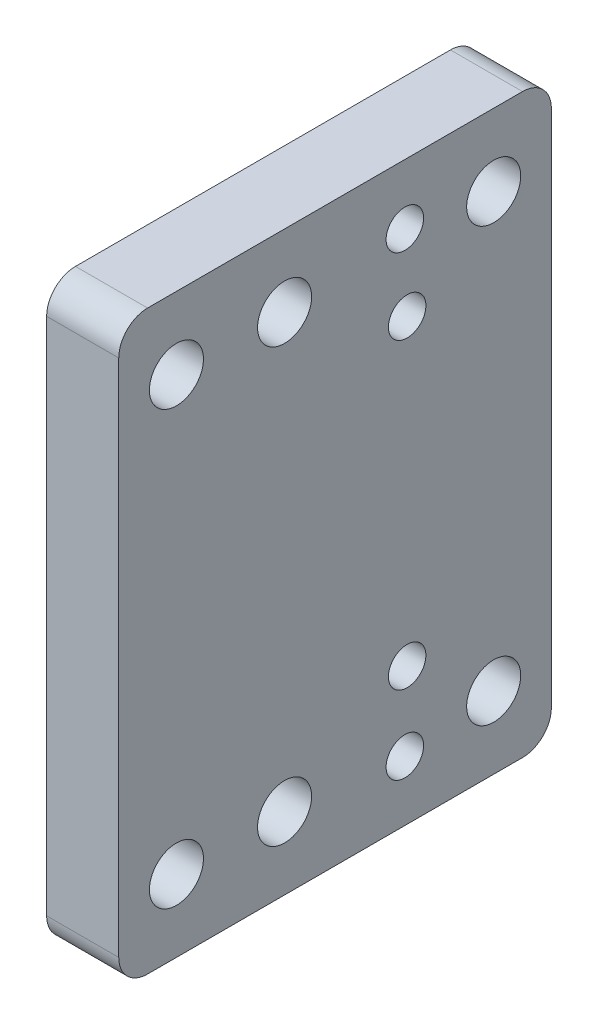
ISO-10303-21;
HEADER;
FILE_DESCRIPTION(('STEP AP214'),'2;1');
FILE_NAME('part.step','',(''),(''),'','','');
FILE_SCHEMA(('AUTOMOTIVE_DESIGN { 1 0 10303 214 1 1 1 1 }'));
ENDSEC;
DATA;
#1=APPLICATION_CONTEXT('core data for automotive mechanical design processes');
#2=APPLICATION_PROTOCOL_DEFINITION('international standard','automotive_design',2000,#1);
#3=PRODUCT_CONTEXT('',#1,'mechanical');
#4=PRODUCT('Part','Part','',(#3));
#5=PRODUCT_RELATED_PRODUCT_CATEGORY('part','',(#4));
#6=PRODUCT_DEFINITION_FORMATION('','',#4);
#7=PRODUCT_DEFINITION_CONTEXT('part definition',#1,'design');
#8=PRODUCT_DEFINITION('design','',#6,#7);
#9=PRODUCT_DEFINITION_SHAPE('','',#8);
#10=(LENGTH_UNIT() NAMED_UNIT(*) SI_UNIT(.MILLI.,.METRE.));
#11=(NAMED_UNIT(*) PLANE_ANGLE_UNIT() SI_UNIT($,.RADIAN.));
#12=(NAMED_UNIT(*) SI_UNIT($,.STERADIAN.) SOLID_ANGLE_UNIT());
#13=UNCERTAINTY_MEASURE_WITH_UNIT(LENGTH_MEASURE(1.E-05),#10,'distance_accuracy_value','');
#14=(GEOMETRIC_REPRESENTATION_CONTEXT(3) GLOBAL_UNCERTAINTY_ASSIGNED_CONTEXT((#13)) GLOBAL_UNIT_ASSIGNED_CONTEXT((#10,
#11,#12)) REPRESENTATION_CONTEXT('',''));
#15=CARTESIAN_POINT('',(0.,0.,0.));
#16=DIRECTION('',(0.,0.,1.));
#17=DIRECTION('',(1.,0.,0.));
#18=AXIS2_PLACEMENT_3D('',#15,#16,#17);
#19=CARTESIAN_POINT('',(-160.02,213.36,0.));
#20=DIRECTION('',(0.,0.,-1.));
#21=DIRECTION('',(-1.,0.,0.));
#22=AXIS2_PLACEMENT_3D('',#19,#20,#21);
#23=PLANE('',#22);
#24=DIRECTION('',(0.,1.,0.));
#25=VECTOR('',#24,1.);
#26=CARTESIAN_POINT('',(-153.67,213.36,0.));
#27=LINE('',#26,#25);
#28=CARTESIAN_POINT('',(-153.67,165.1,0.));
#29=VERTEX_POINT('',#28);
#30=CARTESIAN_POINT('',(-153.67,210.82,0.));
#31=VERTEX_POINT('',#30);
#32=EDGE_CURVE('E194',#29,#31,#27,.T.);
#33=ORIENTED_EDGE('',*,*,#32,.F.);
#34=DIRECTION('',(1.,0.,0.));
#35=VECTOR('',#34,1.);
#36=CARTESIAN_POINT('',(-160.02,165.1,0.));
#37=LINE('',#36,#35);
#38=CARTESIAN_POINT('',(-160.02,165.1,0.));
#39=VERTEX_POINT('',#38);
#40=EDGE_CURVE('E211',#29,#39,#37,.F.);
#41=ORIENTED_EDGE('',*,*,#40,.T.);
#42=DIRECTION('',(0.,1.,0.));
#43=VECTOR('',#42,1.);
#44=CARTESIAN_POINT('',(-160.02,213.36,0.));
#45=LINE('',#44,#43);
#46=CARTESIAN_POINT('',(-160.02,210.82,0.));
#47=VERTEX_POINT('',#46);
#48=EDGE_CURVE('E127',#39,#47,#45,.T.);
#49=ORIENTED_EDGE('',*,*,#48,.T.);
#50=DIRECTION('',(1.,0.,0.));
#51=VECTOR('',#50,1.);
#52=CARTESIAN_POINT('',(-160.02,210.82,0.));
#53=LINE('',#52,#51);
#54=EDGE_CURVE('E207',#47,#31,#53,.T.);
#55=ORIENTED_EDGE('',*,*,#54,.T.);
#56=EDGE_LOOP('',(#33,#41,#49,#55));
#57=FACE_BOUND('',#56,.T.);
#58=ADVANCED_FACE('F39',(#57),#23,.T.);
#59=CARTESIAN_POINT('',(-160.02,162.56,38.1));
#60=DIRECTION('',(0.,-1.,0.));
#61=DIRECTION('',(1.,0.,0.));
#62=AXIS2_PLACEMENT_3D('',#59,#60,#61);
#63=PLANE('',#62);
#64=DIRECTION('',(0.,0.,-1.));
#65=VECTOR('',#64,1.);
#66=CARTESIAN_POINT('',(-160.02,162.56,38.1));
#67=LINE('',#66,#65);
#68=CARTESIAN_POINT('',(-160.02,162.56,35.56));
#69=VERTEX_POINT('',#68);
#70=CARTESIAN_POINT('',(-160.02,162.56,2.54000000000001));
#71=VERTEX_POINT('',#70);
#72=EDGE_CURVE('E132',#69,#71,#67,.T.);
#73=ORIENTED_EDGE('',*,*,#72,.T.);
#74=DIRECTION('',(1.,0.,0.));
#75=VECTOR('',#74,1.);
#76=CARTESIAN_POINT('',(-160.02,162.56,2.54));
#77=LINE('',#76,#75);
#78=CARTESIAN_POINT('',(-153.67,162.56,2.54000000000001));
#79=VERTEX_POINT('',#78);
#80=EDGE_CURVE('E126',#71,#79,#77,.T.);
#81=ORIENTED_EDGE('',*,*,#80,.T.);
#82=DIRECTION('',(0.,0.,-1.));
#83=VECTOR('',#82,1.);
#84=CARTESIAN_POINT('',(-153.67,162.56,38.1));
#85=LINE('',#84,#83);
#86=CARTESIAN_POINT('',(-153.67,162.56,35.56));
#87=VERTEX_POINT('',#86);
#88=EDGE_CURVE('E109',#87,#79,#85,.T.);
#89=ORIENTED_EDGE('',*,*,#88,.F.);
#90=DIRECTION('',(1.,0.,0.));
#91=VECTOR('',#90,1.);
#92=CARTESIAN_POINT('',(-160.02,162.56,35.56));
#93=LINE('',#92,#91);
#94=EDGE_CURVE('E123',#87,#69,#93,.F.);
#95=ORIENTED_EDGE('',*,*,#94,.T.);
#96=EDGE_LOOP('',(#73,#81,#89,#95));
#97=FACE_BOUND('',#96,.T.);
#98=ADVANCED_FACE('F122',(#97),#63,.T.);
#99=CARTESIAN_POINT('',(-160.02,213.36,38.1));
#100=DIRECTION('',(0.,0.,1.));
#101=DIRECTION('',(1.,0.,0.));
#102=AXIS2_PLACEMENT_3D('',#99,#100,#101);
#103=PLANE('',#102);
#104=DIRECTION('',(0.,-1.,0.));
#105=VECTOR('',#104,1.);
#106=CARTESIAN_POINT('',(-160.02,213.36,38.1));
#107=LINE('',#106,#105);
#108=CARTESIAN_POINT('',(-160.02,210.82,38.1));
#109=VERTEX_POINT('',#108);
#110=CARTESIAN_POINT('',(-160.02,165.1,38.1));
#111=VERTEX_POINT('',#110);
#112=EDGE_CURVE('E136',#109,#111,#107,.T.);
#113=ORIENTED_EDGE('',*,*,#112,.T.);
#114=DIRECTION('',(1.,0.,0.));
#115=VECTOR('',#114,1.);
#116=CARTESIAN_POINT('',(-160.02,165.1,38.1));
#117=LINE('',#116,#115);
#118=CARTESIAN_POINT('',(-153.67,165.1,38.1));
#119=VERTEX_POINT('',#118);
#120=EDGE_CURVE('E221',#111,#119,#117,.T.);
#121=ORIENTED_EDGE('',*,*,#120,.T.);
#122=DIRECTION('',(0.,-1.,0.));
#123=VECTOR('',#122,1.);
#124=CARTESIAN_POINT('',(-153.67,213.36,38.1));
#125=LINE('',#124,#123);
#126=CARTESIAN_POINT('',(-153.67,210.82,38.1));
#127=VERTEX_POINT('',#126);
#128=EDGE_CURVE('E111',#127,#119,#125,.T.);
#129=ORIENTED_EDGE('',*,*,#128,.F.);
#130=DIRECTION('',(1.,0.,0.));
#131=VECTOR('',#130,1.);
#132=CARTESIAN_POINT('',(-160.02,210.82,38.1));
#133=LINE('',#132,#131);
#134=EDGE_CURVE('E220',#127,#109,#133,.F.);
#135=ORIENTED_EDGE('',*,*,#134,.T.);
#136=EDGE_LOOP('',(#113,#121,#129,#135));
#137=FACE_BOUND('',#136,.T.);
#138=ADVANCED_FACE('F224',(#137),#103,.T.);
#139=CARTESIAN_POINT('',(-160.02,213.36,38.1));
#140=DIRECTION('',(0.,1.,0.));
#141=DIRECTION('',(-1.,0.,0.));
#142=AXIS2_PLACEMENT_3D('',#139,#140,#141);
#143=PLANE('',#142);
#144=DIRECTION('',(0.,0.,1.));
#145=VECTOR('',#144,1.);
#146=CARTESIAN_POINT('',(-160.02,213.36,38.1));
#147=LINE('',#146,#145);
#148=CARTESIAN_POINT('',(-160.02,213.36,2.54000000000001));
#149=VERTEX_POINT('',#148);
#150=CARTESIAN_POINT('',(-160.02,213.36,35.56));
#151=VERTEX_POINT('',#150);
#152=EDGE_CURVE('E152',#149,#151,#147,.T.);
#153=ORIENTED_EDGE('',*,*,#152,.T.);
#154=DIRECTION('',(1.,0.,0.));
#155=VECTOR('',#154,1.);
#156=CARTESIAN_POINT('',(-160.02,213.36,35.56));
#157=LINE('',#156,#155);
#158=CARTESIAN_POINT('',(-153.67,213.36,35.56));
#159=VERTEX_POINT('',#158);
#160=EDGE_CURVE('E12',#151,#159,#157,.T.);
#161=ORIENTED_EDGE('',*,*,#160,.T.);
#162=DIRECTION('',(0.,0.,1.));
#163=VECTOR('',#162,1.);
#164=CARTESIAN_POINT('',(-153.67,213.36,38.1));
#165=LINE('',#164,#163);
#166=CARTESIAN_POINT('',(-153.67,213.36,2.54000000000001));
#167=VERTEX_POINT('',#166);
#168=EDGE_CURVE('E198',#167,#159,#165,.T.);
#169=ORIENTED_EDGE('',*,*,#168,.F.);
#170=DIRECTION('',(1.,0.,0.));
#171=VECTOR('',#170,1.);
#172=CARTESIAN_POINT('',(-160.02,213.36,2.54));
#173=LINE('',#172,#171);
#174=EDGE_CURVE('E48',#167,#149,#173,.F.);
#175=ORIENTED_EDGE('',*,*,#174,.T.);
#176=EDGE_LOOP('',(#153,#161,#169,#175));
#177=FACE_BOUND('',#176,.T.);
#178=ADVANCED_FACE('F231',(#177),#143,.T.);
#179=CARTESIAN_POINT('',(-160.02,0.,0.));
#180=DIRECTION('',(1.,0.,0.));
#181=DIRECTION('',(0.,1.,0.));
#182=AXIS2_PLACEMENT_3D('',#179,#180,#181);
#183=PLANE('',#182);
#184=CARTESIAN_POINT('',(-160.02,207.01,5.08));
#185=DIRECTION('',(1.,0.,0.));
#186=DIRECTION('',(0.,1.,0.));
#187=AXIS2_PLACEMENT_3D('',#184,#185,#186);
#188=CIRCLE('',#187,2.38125);
#189=CARTESIAN_POINT('',(-160.02,209.39125,5.08));
#190=VERTEX_POINT('',#189);
#191=EDGE_CURVE('E246',#190,#190,#188,.T.);
#192=ORIENTED_EDGE('',*,*,#191,.T.);
#193=EDGE_LOOP('',(#192));
#194=FACE_BOUND('',#193,.T.);
#195=CARTESIAN_POINT('',(-160.02,168.91,5.08));
#196=DIRECTION('',(1.,0.,0.));
#197=DIRECTION('',(0.,1.,0.));
#198=AXIS2_PLACEMENT_3D('',#195,#196,#197);
#199=CIRCLE('',#198,2.38125);
#200=CARTESIAN_POINT('',(-160.02,171.29125,5.08));
#201=VERTEX_POINT('',#200);
#202=EDGE_CURVE('E254',#201,#201,#199,.T.);
#203=ORIENTED_EDGE('',*,*,#202,.T.);
#204=EDGE_LOOP('',(#203));
#205=FACE_BOUND('',#204,.T.);
#206=CARTESIAN_POINT('',(-160.02,207.01,23.495));
#207=DIRECTION('',(1.,0.,0.));
#208=DIRECTION('',(0.,1.,0.));
#209=AXIS2_PLACEMENT_3D('',#206,#207,#208);
#210=CIRCLE('',#209,2.38125);
#211=CARTESIAN_POINT('',(-160.02,209.39125,23.495));
#212=VERTEX_POINT('',#211);
#213=EDGE_CURVE('E265',#212,#212,#210,.T.);
#214=ORIENTED_EDGE('',*,*,#213,.T.);
#215=EDGE_LOOP('',(#214));
#216=FACE_BOUND('',#215,.T.);
#217=CARTESIAN_POINT('',(-160.02,168.91,23.495));
#218=DIRECTION('',(1.,0.,0.));
#219=DIRECTION('',(0.,1.,0.));
#220=AXIS2_PLACEMENT_3D('',#217,#218,#219);
#221=CIRCLE('',#220,2.38125);
#222=CARTESIAN_POINT('',(-160.02,171.29125,23.495));
#223=VERTEX_POINT('',#222);
#224=EDGE_CURVE('E276',#223,#223,#221,.T.);
#225=ORIENTED_EDGE('',*,*,#224,.T.);
#226=EDGE_LOOP('',(#225));
#227=FACE_BOUND('',#226,.T.);
#228=CARTESIAN_POINT('',(-160.02,168.91,33.02));
#229=DIRECTION('',(1.,0.,0.));
#230=DIRECTION('',(0.,1.,0.));
#231=AXIS2_PLACEMENT_3D('',#228,#229,#230);
#232=CIRCLE('',#231,2.38125);
#233=CARTESIAN_POINT('',(-160.02,171.29125,33.02));
#234=VERTEX_POINT('',#233);
#235=EDGE_CURVE('E283',#234,#234,#232,.T.);
#236=ORIENTED_EDGE('',*,*,#235,.T.);
#237=EDGE_LOOP('',(#236));
#238=FACE_BOUND('',#237,.T.);
#239=CARTESIAN_POINT('',(-160.02,207.01,33.02));
#240=DIRECTION('',(1.,0.,0.));
#241=DIRECTION('',(0.,1.,0.));
#242=AXIS2_PLACEMENT_3D('',#239,#240,#241);
#243=CIRCLE('',#242,2.38124999999999);
#244=CARTESIAN_POINT('',(-160.02,209.39125,33.02));
#245=VERTEX_POINT('',#244);
#246=EDGE_CURVE('E292',#245,#245,#243,.T.);
#247=ORIENTED_EDGE('',*,*,#246,.T.);
#248=EDGE_LOOP('',(#247));
#249=FACE_BOUND('',#248,.T.);
#250=CARTESIAN_POINT('',(-160.02,174.625,12.7));
#251=DIRECTION('',(1.,0.,0.));
#252=DIRECTION('',(0.,1.,0.));
#253=AXIS2_PLACEMENT_3D('',#250,#251,#252);
#254=CIRCLE('',#253,1.651);
#255=CARTESIAN_POINT('',(-160.02,176.276,12.7));
#256=VERTEX_POINT('',#255);
#257=EDGE_CURVE('E299',#256,#256,#254,.T.);
#258=ORIENTED_EDGE('',*,*,#257,.T.);
#259=EDGE_LOOP('',(#258));
#260=FACE_BOUND('',#259,.T.);
#261=CARTESIAN_POINT('',(-160.02,201.295,12.7));
#262=DIRECTION('',(1.,0.,0.));
#263=DIRECTION('',(0.,1.,0.));
#264=AXIS2_PLACEMENT_3D('',#261,#262,#263);
#265=CIRCLE('',#264,1.651);
#266=CARTESIAN_POINT('',(-160.02,202.946,12.7));
#267=VERTEX_POINT('',#266);
#268=EDGE_CURVE('E179',#267,#267,#265,.T.);
#269=ORIENTED_EDGE('',*,*,#268,.T.);
#270=EDGE_LOOP('',(#269));
#271=FACE_BOUND('',#270,.T.);
#272=CARTESIAN_POINT('',(-160.02,167.8432,12.9032));
#273=DIRECTION('',(1.,0.,0.));
#274=DIRECTION('',(0.,1.,0.));
#275=AXIS2_PLACEMENT_3D('',#272,#273,#274);
#276=CIRCLE('',#275,1.651);
#277=CARTESIAN_POINT('',(-160.02,169.4942,12.9032));
#278=VERTEX_POINT('',#277);
#279=EDGE_CURVE('E167',#278,#278,#276,.T.);
#280=ORIENTED_EDGE('',*,*,#279,.T.);
#281=EDGE_LOOP('',(#280));
#282=FACE_BOUND('',#281,.T.);
#283=CARTESIAN_POINT('',(-160.02,208.0768,12.9032));
#284=DIRECTION('',(1.,0.,0.));
#285=DIRECTION('',(0.,1.,0.));
#286=AXIS2_PLACEMENT_3D('',#283,#284,#285);
#287=CIRCLE('',#286,1.651);
#288=CARTESIAN_POINT('',(-160.02,209.7278,12.9032));
#289=VERTEX_POINT('',#288);
#290=EDGE_CURVE('E180',#289,#289,#287,.T.);
#291=ORIENTED_EDGE('',*,*,#290,.T.);
#292=EDGE_LOOP('',(#291));
#293=FACE_BOUND('',#292,.T.);
#294=ORIENTED_EDGE('',*,*,#48,.F.);
#295=CARTESIAN_POINT('',(-160.02,165.1,2.54));
#296=DIRECTION('',(1.,0.,0.));
#297=DIRECTION('',(0.,1.,0.));
#298=AXIS2_PLACEMENT_3D('',#295,#296,#297);
#299=CIRCLE('',#298,2.54);
#300=EDGE_CURVE('E218',#39,#71,#299,.F.);
#301=ORIENTED_EDGE('',*,*,#300,.T.);
#302=ORIENTED_EDGE('',*,*,#72,.F.);
#303=CARTESIAN_POINT('',(-160.02,165.1,35.56));
#304=DIRECTION('',(1.,0.,0.));
#305=DIRECTION('',(0.,1.,0.));
#306=AXIS2_PLACEMENT_3D('',#303,#304,#305);
#307=CIRCLE('',#306,2.54);
#308=EDGE_CURVE('E131',#69,#111,#307,.F.);
#309=ORIENTED_EDGE('',*,*,#308,.T.);
#310=ORIENTED_EDGE('',*,*,#112,.F.);
#311=CARTESIAN_POINT('',(-160.02,210.82,35.56));
#312=DIRECTION('',(1.,0.,0.));
#313=DIRECTION('',(0.,1.,0.));
#314=AXIS2_PLACEMENT_3D('',#311,#312,#313);
#315=CIRCLE('',#314,2.54);
#316=EDGE_CURVE('E55',#109,#151,#315,.F.);
#317=ORIENTED_EDGE('',*,*,#316,.T.);
#318=ORIENTED_EDGE('',*,*,#152,.F.);
#319=CARTESIAN_POINT('',(-160.02,210.82,2.54));
#320=DIRECTION('',(1.,0.,0.));
#321=DIRECTION('',(0.,1.,0.));
#322=AXIS2_PLACEMENT_3D('',#319,#320,#321);
#323=CIRCLE('',#322,2.54);
#324=EDGE_CURVE('E214',#149,#47,#323,.F.);
#325=ORIENTED_EDGE('',*,*,#324,.T.);
#326=EDGE_LOOP('',(#294,#301,#302,#309,#310,#317,#318,#325));
#327=FACE_BOUND('',#326,.T.);
#328=ADVANCED_FACE('F227',(#194,#205,#216,#227,#238,#249,#260,#271,#282,#293,#327),#183,.F.);
#329=CARTESIAN_POINT('',(-153.67,0.,0.));
#330=DIRECTION('',(1.,0.,0.));
#331=DIRECTION('',(0.,1.,0.));
#332=AXIS2_PLACEMENT_3D('',#329,#330,#331);
#333=PLANE('',#332);
#334=CARTESIAN_POINT('',(-153.67,207.01,5.08));
#335=DIRECTION('',(1.,0.,0.));
#336=DIRECTION('',(0.,1.,0.));
#337=AXIS2_PLACEMENT_3D('',#334,#335,#336);
#338=CIRCLE('',#337,2.38125);
#339=CARTESIAN_POINT('',(-153.67,209.39125,5.08));
#340=VERTEX_POINT('',#339);
#341=EDGE_CURVE('E251',#340,#340,#338,.T.);
#342=ORIENTED_EDGE('',*,*,#341,.F.);
#343=EDGE_LOOP('',(#342));
#344=FACE_BOUND('',#343,.T.);
#345=CARTESIAN_POINT('',(-153.67,168.91,5.08));
#346=DIRECTION('',(1.,0.,0.));
#347=DIRECTION('',(0.,1.,0.));
#348=AXIS2_PLACEMENT_3D('',#345,#346,#347);
#349=CIRCLE('',#348,2.38125);
#350=CARTESIAN_POINT('',(-153.67,171.29125,5.08));
#351=VERTEX_POINT('',#350);
#352=EDGE_CURVE('E250',#351,#351,#349,.T.);
#353=ORIENTED_EDGE('',*,*,#352,.F.);
#354=EDGE_LOOP('',(#353));
#355=FACE_BOUND('',#354,.T.);
#356=CARTESIAN_POINT('',(-153.67,207.01,23.495));
#357=DIRECTION('',(1.,0.,0.));
#358=DIRECTION('',(0.,1.,0.));
#359=AXIS2_PLACEMENT_3D('',#356,#357,#358);
#360=CIRCLE('',#359,2.38125);
#361=CARTESIAN_POINT('',(-153.67,209.39125,23.495));
#362=VERTEX_POINT('',#361);
#363=EDGE_CURVE('E269',#362,#362,#360,.T.);
#364=ORIENTED_EDGE('',*,*,#363,.F.);
#365=EDGE_LOOP('',(#364));
#366=FACE_BOUND('',#365,.T.);
#367=CARTESIAN_POINT('',(-153.67,168.91,23.495));
#368=DIRECTION('',(1.,0.,0.));
#369=DIRECTION('',(0.,1.,0.));
#370=AXIS2_PLACEMENT_3D('',#367,#368,#369);
#371=CIRCLE('',#370,2.38125);
#372=CARTESIAN_POINT('',(-153.67,171.29125,23.495));
#373=VERTEX_POINT('',#372);
#374=EDGE_CURVE('E268',#373,#373,#371,.T.);
#375=ORIENTED_EDGE('',*,*,#374,.F.);
#376=EDGE_LOOP('',(#375));
#377=FACE_BOUND('',#376,.T.);
#378=CARTESIAN_POINT('',(-153.67,168.91,33.02));
#379=DIRECTION('',(1.,0.,0.));
#380=DIRECTION('',(0.,1.,0.));
#381=AXIS2_PLACEMENT_3D('',#378,#379,#380);
#382=CIRCLE('',#381,2.38125);
#383=CARTESIAN_POINT('',(-153.67,171.29125,33.02));
#384=VERTEX_POINT('',#383);
#385=EDGE_CURVE('E280',#384,#384,#382,.T.);
#386=ORIENTED_EDGE('',*,*,#385,.F.);
#387=EDGE_LOOP('',(#386));
#388=FACE_BOUND('',#387,.T.);
#389=CARTESIAN_POINT('',(-153.67,207.01,33.02));
#390=DIRECTION('',(1.,0.,0.));
#391=DIRECTION('',(0.,1.,0.));
#392=AXIS2_PLACEMENT_3D('',#389,#390,#391);
#393=CIRCLE('',#392,2.38124999999999);
#394=CARTESIAN_POINT('',(-153.67,209.39125,33.02));
#395=VERTEX_POINT('',#394);
#396=EDGE_CURVE('E296',#395,#395,#393,.T.);
#397=ORIENTED_EDGE('',*,*,#396,.F.);
#398=EDGE_LOOP('',(#397));
#399=FACE_BOUND('',#398,.T.);
#400=CARTESIAN_POINT('',(-153.67,174.625,12.7));
#401=DIRECTION('',(1.,0.,0.));
#402=DIRECTION('',(0.,1.,0.));
#403=AXIS2_PLACEMENT_3D('',#400,#401,#402);
#404=CIRCLE('',#403,1.651);
#405=CARTESIAN_POINT('',(-153.67,176.276,12.7));
#406=VERTEX_POINT('',#405);
#407=EDGE_CURVE('E295',#406,#406,#404,.T.);
#408=ORIENTED_EDGE('',*,*,#407,.F.);
#409=EDGE_LOOP('',(#408));
#410=FACE_BOUND('',#409,.T.);
#411=CARTESIAN_POINT('',(-153.67,201.295,12.7));
#412=DIRECTION('',(1.,0.,0.));
#413=DIRECTION('',(0.,1.,0.));
#414=AXIS2_PLACEMENT_3D('',#411,#412,#413);
#415=CIRCLE('',#414,1.651);
#416=CARTESIAN_POINT('',(-153.67,202.946,12.7));
#417=VERTEX_POINT('',#416);
#418=EDGE_CURVE('E174',#417,#417,#415,.T.);
#419=ORIENTED_EDGE('',*,*,#418,.F.);
#420=EDGE_LOOP('',(#419));
#421=FACE_BOUND('',#420,.T.);
#422=CARTESIAN_POINT('',(-153.67,167.8432,12.9032));
#423=DIRECTION('',(1.,0.,0.));
#424=DIRECTION('',(0.,1.,0.));
#425=AXIS2_PLACEMENT_3D('',#422,#423,#424);
#426=CIRCLE('',#425,1.651);
#427=CARTESIAN_POINT('',(-153.67,169.4942,12.9032));
#428=VERTEX_POINT('',#427);
#429=EDGE_CURVE('E173',#428,#428,#426,.T.);
#430=ORIENTED_EDGE('',*,*,#429,.F.);
#431=EDGE_LOOP('',(#430));
#432=FACE_BOUND('',#431,.T.);
#433=CARTESIAN_POINT('',(-153.67,208.0768,12.9032));
#434=DIRECTION('',(1.,0.,0.));
#435=DIRECTION('',(0.,1.,0.));
#436=AXIS2_PLACEMENT_3D('',#433,#434,#435);
#437=CIRCLE('',#436,1.651);
#438=CARTESIAN_POINT('',(-153.67,209.7278,12.9032));
#439=VERTEX_POINT('',#438);
#440=EDGE_CURVE('E172',#439,#439,#437,.T.);
#441=ORIENTED_EDGE('',*,*,#440,.F.);
#442=EDGE_LOOP('',(#441));
#443=FACE_BOUND('',#442,.T.);
#444=ORIENTED_EDGE('',*,*,#88,.T.);
#445=CARTESIAN_POINT('',(-153.67,165.1,2.54));
#446=DIRECTION('',(1.,0.,0.));
#447=DIRECTION('',(0.,1.,0.));
#448=AXIS2_PLACEMENT_3D('',#445,#446,#447);
#449=CIRCLE('',#448,2.54);
#450=EDGE_CURVE('E116',#79,#29,#449,.T.);
#451=ORIENTED_EDGE('',*,*,#450,.T.);
#452=ORIENTED_EDGE('',*,*,#32,.T.);
#453=CARTESIAN_POINT('',(-153.67,210.82,2.54));
#454=DIRECTION('',(1.,0.,0.));
#455=DIRECTION('',(0.,1.,0.));
#456=AXIS2_PLACEMENT_3D('',#453,#454,#455);
#457=CIRCLE('',#456,2.54);
#458=EDGE_CURVE('E134',#31,#167,#457,.T.);
#459=ORIENTED_EDGE('',*,*,#458,.T.);
#460=ORIENTED_EDGE('',*,*,#168,.T.);
#461=CARTESIAN_POINT('',(-153.67,210.82,35.56));
#462=DIRECTION('',(1.,0.,0.));
#463=DIRECTION('',(0.,1.,0.));
#464=AXIS2_PLACEMENT_3D('',#461,#462,#463);
#465=CIRCLE('',#464,2.54);
#466=EDGE_CURVE('E117',#159,#127,#465,.T.);
#467=ORIENTED_EDGE('',*,*,#466,.T.);
#468=ORIENTED_EDGE('',*,*,#128,.T.);
#469=CARTESIAN_POINT('',(-153.67,165.1,35.56));
#470=DIRECTION('',(1.,0.,0.));
#471=DIRECTION('',(0.,1.,0.));
#472=AXIS2_PLACEMENT_3D('',#469,#470,#471);
#473=CIRCLE('',#472,2.54);
#474=EDGE_CURVE('E106',#119,#87,#473,.T.);
#475=ORIENTED_EDGE('',*,*,#474,.T.);
#476=EDGE_LOOP('',(#444,#451,#452,#459,#460,#467,#468,#475));
#477=FACE_BOUND('',#476,.T.);
#478=ADVANCED_FACE('F108',(#344,#355,#366,#377,#388,#399,#410,#421,#432,#443,#477),#333,.T.);
#479=CARTESIAN_POINT('',(-160.02,208.0768,12.9032));
#480=DIRECTION('',(1.,0.,0.));
#481=DIRECTION('',(0.,1.,0.));
#482=AXIS2_PLACEMENT_3D('',#479,#480,#481);
#483=CYLINDRICAL_SURFACE('',#482,1.651);
#484=ORIENTED_EDGE('',*,*,#290,.F.);
#485=EDGE_LOOP('',(#484));
#486=FACE_BOUND('',#485,.T.);
#487=ORIENTED_EDGE('',*,*,#440,.T.);
#488=EDGE_LOOP('',(#487));
#489=FACE_BOUND('',#488,.T.);
#490=ADVANCED_FACE('F316',(#486,#489),#483,.F.);
#491=CARTESIAN_POINT('',(-160.02,167.8432,12.9032));
#492=DIRECTION('',(1.,0.,0.));
#493=DIRECTION('',(0.,1.,0.));
#494=AXIS2_PLACEMENT_3D('',#491,#492,#493);
#495=CYLINDRICAL_SURFACE('',#494,1.651);
#496=ORIENTED_EDGE('',*,*,#279,.F.);
#497=EDGE_LOOP('',(#496));
#498=FACE_BOUND('',#497,.T.);
#499=ORIENTED_EDGE('',*,*,#429,.T.);
#500=EDGE_LOOP('',(#499));
#501=FACE_BOUND('',#500,.T.);
#502=ADVANCED_FACE('F322',(#498,#501),#495,.F.);
#503=CARTESIAN_POINT('',(-160.02,201.295,12.7));
#504=DIRECTION('',(1.,0.,0.));
#505=DIRECTION('',(0.,1.,0.));
#506=AXIS2_PLACEMENT_3D('',#503,#504,#505);
#507=CYLINDRICAL_SURFACE('',#506,1.651);
#508=ORIENTED_EDGE('',*,*,#268,.F.);
#509=EDGE_LOOP('',(#508));
#510=FACE_BOUND('',#509,.T.);
#511=ORIENTED_EDGE('',*,*,#418,.T.);
#512=EDGE_LOOP('',(#511));
#513=FACE_BOUND('',#512,.T.);
#514=ADVANCED_FACE('F312',(#510,#513),#507,.F.);
#515=CARTESIAN_POINT('',(-160.02,174.625,12.7));
#516=DIRECTION('',(1.,0.,0.));
#517=DIRECTION('',(0.,1.,0.));
#518=AXIS2_PLACEMENT_3D('',#515,#516,#517);
#519=CYLINDRICAL_SURFACE('',#518,1.651);
#520=ORIENTED_EDGE('',*,*,#257,.F.);
#521=EDGE_LOOP('',(#520));
#522=FACE_BOUND('',#521,.T.);
#523=ORIENTED_EDGE('',*,*,#407,.T.);
#524=EDGE_LOOP('',(#523));
#525=FACE_BOUND('',#524,.T.);
#526=ADVANCED_FACE('F330',(#522,#525),#519,.F.);
#527=CARTESIAN_POINT('',(-160.02,207.01,33.02));
#528=DIRECTION('',(1.,0.,0.));
#529=DIRECTION('',(0.,1.,0.));
#530=AXIS2_PLACEMENT_3D('',#527,#528,#529);
#531=CYLINDRICAL_SURFACE('',#530,2.38124999999999);
#532=ORIENTED_EDGE('',*,*,#246,.F.);
#533=EDGE_LOOP('',(#532));
#534=FACE_BOUND('',#533,.T.);
#535=ORIENTED_EDGE('',*,*,#396,.T.);
#536=EDGE_LOOP('',(#535));
#537=FACE_BOUND('',#536,.T.);
#538=ADVANCED_FACE('F431',(#534,#537),#531,.F.);
#539=CARTESIAN_POINT('',(-160.02,168.91,33.02));
#540=DIRECTION('',(1.,0.,0.));
#541=DIRECTION('',(0.,1.,0.));
#542=AXIS2_PLACEMENT_3D('',#539,#540,#541);
#543=CYLINDRICAL_SURFACE('',#542,2.38125);
#544=ORIENTED_EDGE('',*,*,#235,.F.);
#545=EDGE_LOOP('',(#544));
#546=FACE_BOUND('',#545,.T.);
#547=ORIENTED_EDGE('',*,*,#385,.T.);
#548=EDGE_LOOP('',(#547));
#549=FACE_BOUND('',#548,.T.);
#550=ADVANCED_FACE('F421',(#546,#549),#543,.F.);
#551=CARTESIAN_POINT('',(-160.02,168.91,23.495));
#552=DIRECTION('',(1.,0.,0.));
#553=DIRECTION('',(0.,1.,0.));
#554=AXIS2_PLACEMENT_3D('',#551,#552,#553);
#555=CYLINDRICAL_SURFACE('',#554,2.38125);
#556=ORIENTED_EDGE('',*,*,#224,.F.);
#557=EDGE_LOOP('',(#556));
#558=FACE_BOUND('',#557,.T.);
#559=ORIENTED_EDGE('',*,*,#374,.T.);
#560=EDGE_LOOP('',(#559));
#561=FACE_BOUND('',#560,.T.);
#562=ADVANCED_FACE('F411',(#558,#561),#555,.F.);
#563=CARTESIAN_POINT('',(-160.02,207.01,23.495));
#564=DIRECTION('',(1.,0.,0.));
#565=DIRECTION('',(0.,1.,0.));
#566=AXIS2_PLACEMENT_3D('',#563,#564,#565);
#567=CYLINDRICAL_SURFACE('',#566,2.38125);
#568=ORIENTED_EDGE('',*,*,#213,.F.);
#569=EDGE_LOOP('',(#568));
#570=FACE_BOUND('',#569,.T.);
#571=ORIENTED_EDGE('',*,*,#363,.T.);
#572=EDGE_LOOP('',(#571));
#573=FACE_BOUND('',#572,.T.);
#574=ADVANCED_FACE('F401',(#570,#573),#567,.F.);
#575=CARTESIAN_POINT('',(-160.02,168.91,5.08));
#576=DIRECTION('',(1.,0.,0.));
#577=DIRECTION('',(0.,1.,0.));
#578=AXIS2_PLACEMENT_3D('',#575,#576,#577);
#579=CYLINDRICAL_SURFACE('',#578,2.38125);
#580=ORIENTED_EDGE('',*,*,#202,.F.);
#581=EDGE_LOOP('',(#580));
#582=FACE_BOUND('',#581,.T.);
#583=ORIENTED_EDGE('',*,*,#352,.T.);
#584=EDGE_LOOP('',(#583));
#585=FACE_BOUND('',#584,.T.);
#586=ADVANCED_FACE('F390',(#582,#585),#579,.F.);
#587=CARTESIAN_POINT('',(-160.02,207.01,5.08));
#588=DIRECTION('',(1.,0.,0.));
#589=DIRECTION('',(0.,1.,0.));
#590=AXIS2_PLACEMENT_3D('',#587,#588,#589);
#591=CYLINDRICAL_SURFACE('',#590,2.38125);
#592=ORIENTED_EDGE('',*,*,#191,.F.);
#593=EDGE_LOOP('',(#592));
#594=FACE_BOUND('',#593,.T.);
#595=ORIENTED_EDGE('',*,*,#341,.T.);
#596=EDGE_LOOP('',(#595));
#597=FACE_BOUND('',#596,.T.);
#598=ADVANCED_FACE('F349',(#594,#597),#591,.F.);
#599=CARTESIAN_POINT('',(-160.02,165.1,2.54));
#600=DIRECTION('',(1.,0.,0.));
#601=DIRECTION('',(0.,1.,0.));
#602=AXIS2_PLACEMENT_3D('',#599,#600,#601);
#603=CYLINDRICAL_SURFACE('',#602,2.54);
#604=ORIENTED_EDGE('',*,*,#300,.F.);
#605=ORIENTED_EDGE('',*,*,#40,.F.);
#606=ORIENTED_EDGE('',*,*,#450,.F.);
#607=ORIENTED_EDGE('',*,*,#80,.F.);
#608=EDGE_LOOP('',(#604,#605,#606,#607));
#609=FACE_BOUND('',#608,.T.);
#610=ADVANCED_FACE('F346',(#609),#603,.T.);
#611=CARTESIAN_POINT('',(-160.02,165.1,35.56));
#612=DIRECTION('',(1.,0.,0.));
#613=DIRECTION('',(0.,1.,0.));
#614=AXIS2_PLACEMENT_3D('',#611,#612,#613);
#615=CYLINDRICAL_SURFACE('',#614,2.54);
#616=ORIENTED_EDGE('',*,*,#308,.F.);
#617=ORIENTED_EDGE('',*,*,#94,.F.);
#618=ORIENTED_EDGE('',*,*,#474,.F.);
#619=ORIENTED_EDGE('',*,*,#120,.F.);
#620=EDGE_LOOP('',(#616,#617,#618,#619));
#621=FACE_BOUND('',#620,.T.);
#622=ADVANCED_FACE('F130',(#621),#615,.T.);
#623=CARTESIAN_POINT('',(-160.02,210.82,35.56));
#624=DIRECTION('',(1.,0.,0.));
#625=DIRECTION('',(0.,1.,0.));
#626=AXIS2_PLACEMENT_3D('',#623,#624,#625);
#627=CYLINDRICAL_SURFACE('',#626,2.54);
#628=ORIENTED_EDGE('',*,*,#316,.F.);
#629=ORIENTED_EDGE('',*,*,#134,.F.);
#630=ORIENTED_EDGE('',*,*,#466,.F.);
#631=ORIENTED_EDGE('',*,*,#160,.F.);
#632=EDGE_LOOP('',(#628,#629,#630,#631));
#633=FACE_BOUND('',#632,.T.);
#634=ADVANCED_FACE('F230',(#633),#627,.T.);
#635=CARTESIAN_POINT('',(-160.02,210.82,2.54));
#636=DIRECTION('',(1.,0.,0.));
#637=DIRECTION('',(0.,1.,0.));
#638=AXIS2_PLACEMENT_3D('',#635,#636,#637);
#639=CYLINDRICAL_SURFACE('',#638,2.54);
#640=ORIENTED_EDGE('',*,*,#324,.F.);
#641=ORIENTED_EDGE('',*,*,#174,.F.);
#642=ORIENTED_EDGE('',*,*,#458,.F.);
#643=ORIENTED_EDGE('',*,*,#54,.F.);
#644=EDGE_LOOP('',(#640,#641,#642,#643));
#645=FACE_BOUND('',#644,.T.);
#646=ADVANCED_FACE('F41',(#645),#639,.T.);
#647=CLOSED_SHELL('',(#58,#98,#138,#178,#328,#478,#490,#502,#514,#526,#538,#550,#562,#574,#586,
#598,#610,#622,#634,#646));
#648=MANIFOLD_SOLID_BREP('B2',#647);
#649=ADVANCED_BREP_SHAPE_REPRESENTATION('',(#18,#648),#14);
#650=SHAPE_DEFINITION_REPRESENTATION(#9,#649);
ENDSEC;
END-ISO-10303-21;
